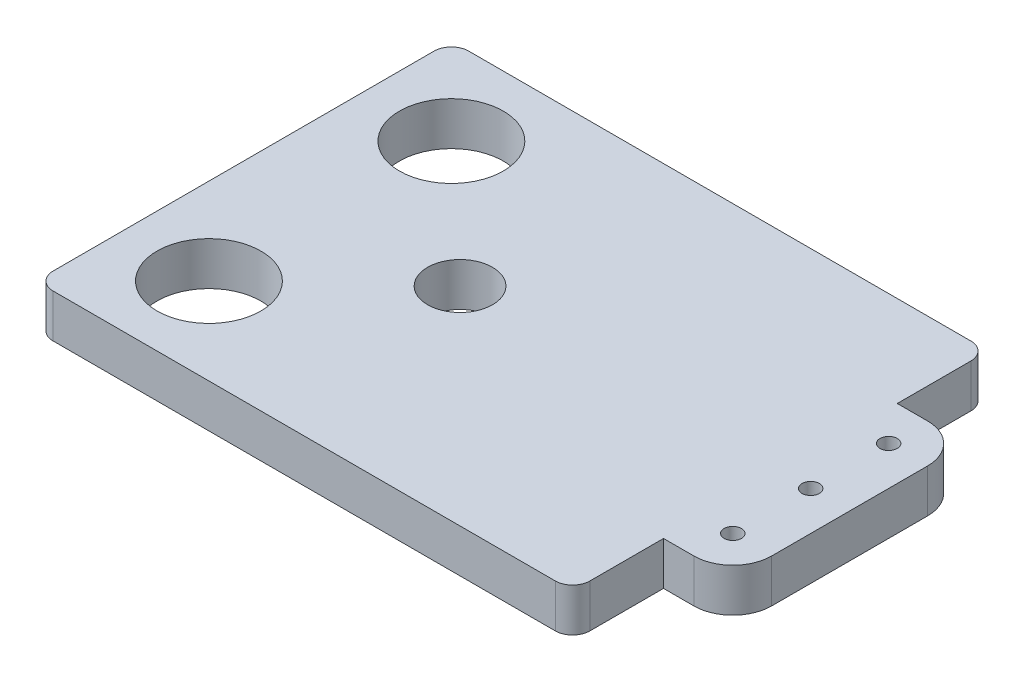
ISO-10303-21;
HEADER;
FILE_DESCRIPTION(('STEP AP214'),'2;1');
FILE_NAME('part.step','',(''),(''),'','','');
FILE_SCHEMA(('AUTOMOTIVE_DESIGN { 1 0 10303 214 1 1 1 1 }'));
ENDSEC;
DATA;
#1=APPLICATION_CONTEXT('core data for automotive mechanical design processes');
#2=APPLICATION_PROTOCOL_DEFINITION('international standard','automotive_design',2000,#1);
#3=PRODUCT_CONTEXT('',#1,'mechanical');
#4=PRODUCT('Part','Part','',(#3));
#5=PRODUCT_RELATED_PRODUCT_CATEGORY('part','',(#4));
#6=PRODUCT_DEFINITION_FORMATION('','',#4);
#7=PRODUCT_DEFINITION_CONTEXT('part definition',#1,'design');
#8=PRODUCT_DEFINITION('design','',#6,#7);
#9=PRODUCT_DEFINITION_SHAPE('','',#8);
#10=(LENGTH_UNIT() NAMED_UNIT(*) SI_UNIT(.MILLI.,.METRE.));
#11=(NAMED_UNIT(*) PLANE_ANGLE_UNIT() SI_UNIT($,.RADIAN.));
#12=(NAMED_UNIT(*) SI_UNIT($,.STERADIAN.) SOLID_ANGLE_UNIT());
#13=UNCERTAINTY_MEASURE_WITH_UNIT(LENGTH_MEASURE(1.E-05),#10,'distance_accuracy_value','');
#14=(GEOMETRIC_REPRESENTATION_CONTEXT(3) GLOBAL_UNCERTAINTY_ASSIGNED_CONTEXT((#13)) GLOBAL_UNIT_ASSIGNED_CONTEXT((#10,
#11,#12)) REPRESENTATION_CONTEXT('',''));
#15=CARTESIAN_POINT('',(0.,0.,0.));
#16=DIRECTION('',(0.,0.,1.));
#17=DIRECTION('',(1.,0.,0.));
#18=AXIS2_PLACEMENT_3D('',#15,#16,#17);
#19=CARTESIAN_POINT('',(0.,5.,-10.5));
#20=DIRECTION('',(0.,0.,1.));
#21=DIRECTION('',(1.,0.,0.));
#22=AXIS2_PLACEMENT_3D('',#19,#20,#21);
#23=PLANE('',#22);
#24=DIRECTION('',(-1.,0.,0.));
#25=VECTOR('',#24,1.);
#26=CARTESIAN_POINT('',(0.,0.,-10.5));
#27=LINE('',#26,#25);
#28=CARTESIAN_POINT('',(65.5,0.,-10.5));
#29=VERTEX_POINT('',#28);
#30=CARTESIAN_POINT('',(62.,0.,-10.5));
#31=VERTEX_POINT('',#30);
#32=EDGE_CURVE('E144',#29,#31,#27,.T.);
#33=ORIENTED_EDGE('',*,*,#32,.F.);
#34=DIRECTION('',(0.,-1.,0.));
#35=VECTOR('',#34,1.);
#36=CARTESIAN_POINT('',(65.5,5.,-10.5));
#37=LINE('',#36,#35);
#38=CARTESIAN_POINT('',(65.5,5.,-10.5));
#39=VERTEX_POINT('',#38);
#40=EDGE_CURVE('E139',#39,#29,#37,.T.);
#41=ORIENTED_EDGE('',*,*,#40,.F.);
#42=DIRECTION('',(-1.,0.,0.));
#43=VECTOR('',#42,1.);
#44=CARTESIAN_POINT('',(0.,5.,-10.5));
#45=LINE('',#44,#43);
#46=CARTESIAN_POINT('',(62.,5.,-10.5));
#47=VERTEX_POINT('',#46);
#48=EDGE_CURVE('E142',#39,#47,#45,.T.);
#49=ORIENTED_EDGE('',*,*,#48,.T.);
#50=DIRECTION('',(0.,-1.,0.));
#51=VECTOR('',#50,1.);
#52=CARTESIAN_POINT('',(62.,5.,-10.5));
#53=LINE('',#52,#51);
#54=EDGE_CURVE('E186',#47,#31,#53,.T.);
#55=ORIENTED_EDGE('',*,*,#54,.T.);
#56=EDGE_LOOP('',(#33,#41,#49,#55));
#57=FACE_BOUND('',#56,.T.);
#58=ADVANCED_FACE('F35',(#57),#23,.T.);
#59=CARTESIAN_POINT('',(65.5,5.,-15.));
#60=DIRECTION('',(0.,-1.,0.));
#61=DIRECTION('',(0.,0.,-1.));
#62=AXIS2_PLACEMENT_3D('',#59,#60,#61);
#63=CYLINDRICAL_SURFACE('',#62,4.5);
#64=CARTESIAN_POINT('',(65.5,0.,-15.));
#65=DIRECTION('',(0.,1.,0.));
#66=DIRECTION('',(0.,0.,1.));
#67=AXIS2_PLACEMENT_3D('',#64,#65,#66);
#68=CIRCLE('',#67,4.5);
#69=CARTESIAN_POINT('',(70.,0.,-15.));
#70=VERTEX_POINT('',#69);
#71=EDGE_CURVE('E206',#29,#70,#68,.T.);
#72=ORIENTED_EDGE('',*,*,#71,.T.);
#73=DIRECTION('',(0.,-1.,0.));
#74=VECTOR('',#73,1.);
#75=CARTESIAN_POINT('',(70.,5.,-15.));
#76=LINE('',#75,#74);
#77=CARTESIAN_POINT('',(70.,5.,-15.));
#78=VERTEX_POINT('',#77);
#79=EDGE_CURVE('E149',#78,#70,#76,.T.);
#80=ORIENTED_EDGE('',*,*,#79,.F.);
#81=CARTESIAN_POINT('',(65.5,5.,-15.));
#82=DIRECTION('',(0.,1.,0.));
#83=DIRECTION('',(0.,0.,1.));
#84=AXIS2_PLACEMENT_3D('',#81,#82,#83);
#85=CIRCLE('',#84,4.5);
#86=EDGE_CURVE('E152',#39,#78,#85,.T.);
#87=ORIENTED_EDGE('',*,*,#86,.F.);
#88=ORIENTED_EDGE('',*,*,#40,.T.);
#89=EDGE_LOOP('',(#72,#80,#87,#88));
#90=FACE_BOUND('',#89,.T.);
#91=ADVANCED_FACE('F153',(#90),#63,.T.);
#92=CARTESIAN_POINT('',(70.,5.,0.));
#93=DIRECTION('',(1.,0.,0.));
#94=DIRECTION('',(0.,0.,-1.));
#95=AXIS2_PLACEMENT_3D('',#92,#93,#94);
#96=PLANE('',#95);
#97=DIRECTION('',(0.,0.,1.));
#98=VECTOR('',#97,1.);
#99=CARTESIAN_POINT('',(70.,0.,0.));
#100=LINE('',#99,#98);
#101=CARTESIAN_POINT('',(70.,0.,-33.));
#102=VERTEX_POINT('',#101);
#103=EDGE_CURVE('E208',#102,#70,#100,.T.);
#104=ORIENTED_EDGE('',*,*,#103,.F.);
#105=DIRECTION('',(0.,-1.,0.));
#106=VECTOR('',#105,1.);
#107=CARTESIAN_POINT('',(70.,5.,-33.));
#108=LINE('',#107,#106);
#109=CARTESIAN_POINT('',(70.,5.,-33.));
#110=VERTEX_POINT('',#109);
#111=EDGE_CURVE('E238',#110,#102,#108,.T.);
#112=ORIENTED_EDGE('',*,*,#111,.F.);
#113=DIRECTION('',(0.,0.,1.));
#114=VECTOR('',#113,1.);
#115=CARTESIAN_POINT('',(70.,5.,0.));
#116=LINE('',#115,#114);
#117=EDGE_CURVE('E156',#110,#78,#116,.T.);
#118=ORIENTED_EDGE('',*,*,#117,.T.);
#119=ORIENTED_EDGE('',*,*,#79,.T.);
#120=EDGE_LOOP('',(#104,#112,#118,#119));
#121=FACE_BOUND('',#120,.T.);
#122=ADVANCED_FACE('F292',(#121),#96,.T.);
#123=CARTESIAN_POINT('',(65.5,5.,-33.));
#124=DIRECTION('',(0.,-1.,0.));
#125=DIRECTION('',(0.,0.,-1.));
#126=AXIS2_PLACEMENT_3D('',#123,#124,#125);
#127=CYLINDRICAL_SURFACE('',#126,4.5);
#128=CARTESIAN_POINT('',(65.5,0.,-33.));
#129=DIRECTION('',(0.,1.,0.));
#130=DIRECTION('',(0.,0.,1.));
#131=AXIS2_PLACEMENT_3D('',#128,#129,#130);
#132=CIRCLE('',#131,4.5);
#133=CARTESIAN_POINT('',(65.5,0.,-37.5));
#134=VERTEX_POINT('',#133);
#135=EDGE_CURVE('E211',#102,#134,#132,.T.);
#136=ORIENTED_EDGE('',*,*,#135,.T.);
#137=DIRECTION('',(0.,-1.,0.));
#138=VECTOR('',#137,1.);
#139=CARTESIAN_POINT('',(65.5,5.,-37.5));
#140=LINE('',#139,#138);
#141=CARTESIAN_POINT('',(65.5,5.,-37.5));
#142=VERTEX_POINT('',#141);
#143=EDGE_CURVE('E235',#142,#134,#140,.T.);
#144=ORIENTED_EDGE('',*,*,#143,.F.);
#145=CARTESIAN_POINT('',(65.5,5.,-33.));
#146=DIRECTION('',(0.,1.,0.));
#147=DIRECTION('',(0.,0.,1.));
#148=AXIS2_PLACEMENT_3D('',#145,#146,#147);
#149=CIRCLE('',#148,4.5);
#150=EDGE_CURVE('E169',#110,#142,#149,.T.);
#151=ORIENTED_EDGE('',*,*,#150,.F.);
#152=ORIENTED_EDGE('',*,*,#111,.T.);
#153=EDGE_LOOP('',(#136,#144,#151,#152));
#154=FACE_BOUND('',#153,.T.);
#155=ADVANCED_FACE('F297',(#154),#127,.T.);
#156=CARTESIAN_POINT('',(0.,5.,-37.5));
#157=DIRECTION('',(0.,0.,1.));
#158=DIRECTION('',(1.,0.,0.));
#159=AXIS2_PLACEMENT_3D('',#156,#157,#158);
#160=PLANE('',#159);
#161=DIRECTION('',(-1.,0.,0.));
#162=VECTOR('',#161,1.);
#163=CARTESIAN_POINT('',(0.,0.,-37.5));
#164=LINE('',#163,#162);
#165=CARTESIAN_POINT('',(62.,0.,-37.5));
#166=VERTEX_POINT('',#165);
#167=EDGE_CURVE('E214',#134,#166,#164,.T.);
#168=ORIENTED_EDGE('',*,*,#167,.T.);
#169=DIRECTION('',(0.,-1.,0.));
#170=VECTOR('',#169,1.);
#171=CARTESIAN_POINT('',(62.,5.,-37.5));
#172=LINE('',#171,#170);
#173=CARTESIAN_POINT('',(62.,5.,-37.5));
#174=VERTEX_POINT('',#173);
#175=EDGE_CURVE('E232',#174,#166,#172,.T.);
#176=ORIENTED_EDGE('',*,*,#175,.F.);
#177=DIRECTION('',(-1.,0.,0.));
#178=VECTOR('',#177,1.);
#179=CARTESIAN_POINT('',(0.,5.,-37.5));
#180=LINE('',#179,#178);
#181=EDGE_CURVE('E172',#142,#174,#180,.T.);
#182=ORIENTED_EDGE('',*,*,#181,.F.);
#183=ORIENTED_EDGE('',*,*,#143,.T.);
#184=EDGE_LOOP('',(#168,#176,#182,#183));
#185=FACE_BOUND('',#184,.T.);
#186=ADVANCED_FACE('F299',(#185),#160,.F.);
#187=CARTESIAN_POINT('',(62.,5.,0.));
#188=DIRECTION('',(1.,0.,0.));
#189=DIRECTION('',(0.,0.,-1.));
#190=AXIS2_PLACEMENT_3D('',#187,#188,#189);
#191=PLANE('',#190);
#192=DIRECTION('',(0.,0.,1.));
#193=VECTOR('',#192,1.);
#194=CARTESIAN_POINT('',(62.,0.,0.));
#195=LINE('',#194,#193);
#196=CARTESIAN_POINT('',(62.,0.,-46.));
#197=VERTEX_POINT('',#196);
#198=EDGE_CURVE('E217',#197,#166,#195,.T.);
#199=ORIENTED_EDGE('',*,*,#198,.F.);
#200=DIRECTION('',(0.,-1.,0.));
#201=VECTOR('',#200,1.);
#202=CARTESIAN_POINT('',(62.,5.,-46.));
#203=LINE('',#202,#201);
#204=CARTESIAN_POINT('',(62.,5.,-46.));
#205=VERTEX_POINT('',#204);
#206=EDGE_CURVE('E253',#197,#205,#203,.F.);
#207=ORIENTED_EDGE('',*,*,#206,.T.);
#208=DIRECTION('',(0.,0.,1.));
#209=VECTOR('',#208,1.);
#210=CARTESIAN_POINT('',(62.,5.,0.));
#211=LINE('',#210,#209);
#212=EDGE_CURVE('E175',#205,#174,#211,.T.);
#213=ORIENTED_EDGE('',*,*,#212,.T.);
#214=ORIENTED_EDGE('',*,*,#175,.T.);
#215=EDGE_LOOP('',(#199,#207,#213,#214));
#216=FACE_BOUND('',#215,.T.);
#217=ADVANCED_FACE('F302',(#216),#191,.T.);
#218=CARTESIAN_POINT('',(0.,5.,-48.));
#219=DIRECTION('',(0.,0.,-1.));
#220=DIRECTION('',(-1.,0.,0.));
#221=AXIS2_PLACEMENT_3D('',#218,#219,#220);
#222=PLANE('',#221);
#223=DIRECTION('',(1.,0.,0.));
#224=VECTOR('',#223,1.);
#225=CARTESIAN_POINT('',(0.,5.,-48.));
#226=LINE('',#225,#224);
#227=CARTESIAN_POINT('',(2.,5.,-48.));
#228=VERTEX_POINT('',#227);
#229=CARTESIAN_POINT('',(60.,5.,-48.));
#230=VERTEX_POINT('',#229);
#231=EDGE_CURVE('E177',#228,#230,#226,.T.);
#232=ORIENTED_EDGE('',*,*,#231,.T.);
#233=DIRECTION('',(0.,-1.,0.));
#234=VECTOR('',#233,1.);
#235=CARTESIAN_POINT('',(60.,5.,-48.));
#236=LINE('',#235,#234);
#237=CARTESIAN_POINT('',(60.,0.,-48.));
#238=VERTEX_POINT('',#237);
#239=EDGE_CURVE('E242',#230,#238,#236,.T.);
#240=ORIENTED_EDGE('',*,*,#239,.T.);
#241=DIRECTION('',(1.,0.,0.));
#242=VECTOR('',#241,1.);
#243=CARTESIAN_POINT('',(0.,0.,-48.));
#244=LINE('',#243,#242);
#245=CARTESIAN_POINT('',(2.,0.,-48.));
#246=VERTEX_POINT('',#245);
#247=EDGE_CURVE('E219',#246,#238,#244,.T.);
#248=ORIENTED_EDGE('',*,*,#247,.F.);
#249=DIRECTION('',(0.,-1.,0.));
#250=VECTOR('',#249,1.);
#251=CARTESIAN_POINT('',(2.,5.,-48.));
#252=LINE('',#251,#250);
#253=EDGE_CURVE('E148',#246,#228,#252,.F.);
#254=ORIENTED_EDGE('',*,*,#253,.T.);
#255=EDGE_LOOP('',(#232,#240,#248,#254));
#256=FACE_BOUND('',#255,.T.);
#257=ADVANCED_FACE('F310',(#256),#222,.T.);
#258=CARTESIAN_POINT('',(0.,5.,0.));
#259=DIRECTION('',(-1.,0.,0.));
#260=DIRECTION('',(0.,0.,1.));
#261=AXIS2_PLACEMENT_3D('',#258,#259,#260);
#262=PLANE('',#261);
#263=DIRECTION('',(0.,0.,-1.));
#264=VECTOR('',#263,1.);
#265=CARTESIAN_POINT('',(0.,5.,0.));
#266=LINE('',#265,#264);
#267=CARTESIAN_POINT('',(0.,5.,-2.));
#268=VERTEX_POINT('',#267);
#269=CARTESIAN_POINT('',(0.,5.,-46.));
#270=VERTEX_POINT('',#269);
#271=EDGE_CURVE('E180',#268,#270,#266,.T.);
#272=ORIENTED_EDGE('',*,*,#271,.T.);
#273=DIRECTION('',(0.,-1.,0.));
#274=VECTOR('',#273,1.);
#275=CARTESIAN_POINT('',(0.,5.,-46.));
#276=LINE('',#275,#274);
#277=CARTESIAN_POINT('',(0.,0.,-46.));
#278=VERTEX_POINT('',#277);
#279=EDGE_CURVE('E11',#270,#278,#276,.T.);
#280=ORIENTED_EDGE('',*,*,#279,.T.);
#281=DIRECTION('',(0.,0.,-1.));
#282=VECTOR('',#281,1.);
#283=CARTESIAN_POINT('',(0.,0.,0.));
#284=LINE('',#283,#282);
#285=CARTESIAN_POINT('',(0.,0.,-2.));
#286=VERTEX_POINT('',#285);
#287=EDGE_CURVE('E222',#286,#278,#284,.T.);
#288=ORIENTED_EDGE('',*,*,#287,.F.);
#289=DIRECTION('',(0.,-1.,0.));
#290=VECTOR('',#289,1.);
#291=CARTESIAN_POINT('',(0.,5.,-2.));
#292=LINE('',#291,#290);
#293=EDGE_CURVE('E43',#286,#268,#292,.F.);
#294=ORIENTED_EDGE('',*,*,#293,.T.);
#295=EDGE_LOOP('',(#272,#280,#288,#294));
#296=FACE_BOUND('',#295,.T.);
#297=ADVANCED_FACE('F272',(#296),#262,.T.);
#298=CARTESIAN_POINT('',(0.,5.,0.));
#299=DIRECTION('',(0.,0.,-1.));
#300=DIRECTION('',(-1.,0.,0.));
#301=AXIS2_PLACEMENT_3D('',#298,#299,#300);
#302=PLANE('',#301);
#303=DIRECTION('',(1.,0.,0.));
#304=VECTOR('',#303,1.);
#305=CARTESIAN_POINT('',(0.,0.,0.));
#306=LINE('',#305,#304);
#307=CARTESIAN_POINT('',(2.,0.,0.));
#308=VERTEX_POINT('',#307);
#309=CARTESIAN_POINT('',(60.,0.,0.));
#310=VERTEX_POINT('',#309);
#311=EDGE_CURVE('E225',#308,#310,#306,.T.);
#312=ORIENTED_EDGE('',*,*,#311,.T.);
#313=DIRECTION('',(0.,-1.,0.));
#314=VECTOR('',#313,1.);
#315=CARTESIAN_POINT('',(60.,5.,0.));
#316=LINE('',#315,#314);
#317=CARTESIAN_POINT('',(60.,5.,0.));
#318=VERTEX_POINT('',#317);
#319=EDGE_CURVE('E58',#310,#318,#316,.F.);
#320=ORIENTED_EDGE('',*,*,#319,.T.);
#321=DIRECTION('',(1.,0.,0.));
#322=VECTOR('',#321,1.);
#323=CARTESIAN_POINT('',(0.,5.,0.));
#324=LINE('',#323,#322);
#325=CARTESIAN_POINT('',(2.,5.,0.));
#326=VERTEX_POINT('',#325);
#327=EDGE_CURVE('E183',#326,#318,#324,.T.);
#328=ORIENTED_EDGE('',*,*,#327,.F.);
#329=DIRECTION('',(0.,-1.,0.));
#330=VECTOR('',#329,1.);
#331=CARTESIAN_POINT('',(2.,0.,0.));
#332=LINE('',#331,#330);
#333=EDGE_CURVE('E265',#326,#308,#332,.T.);
#334=ORIENTED_EDGE('',*,*,#333,.T.);
#335=EDGE_LOOP('',(#312,#320,#328,#334));
#336=FACE_BOUND('',#335,.T.);
#337=ADVANCED_FACE('F280',(#336),#302,.F.);
#338=CARTESIAN_POINT('',(65.5,5.,-33.));
#339=DIRECTION('',(0.,-1.,0.));
#340=DIRECTION('',(0.,0.,-1.));
#341=AXIS2_PLACEMENT_3D('',#338,#339,#340);
#342=CYLINDRICAL_SURFACE('',#341,0.999999999999998);
#343=CARTESIAN_POINT('',(65.5,5.,-33.));
#344=DIRECTION('',(0.,1.,0.));
#345=DIRECTION('',(0.,0.,1.));
#346=AXIS2_PLACEMENT_3D('',#343,#344,#345);
#347=CIRCLE('',#346,0.999999999999998);
#348=CARTESIAN_POINT('',(65.5,5.,-32.));
#349=VERTEX_POINT('',#348);
#350=EDGE_CURVE('E161',#349,#349,#347,.T.);
#351=ORIENTED_EDGE('',*,*,#350,.T.);
#352=EDGE_LOOP('',(#351));
#353=FACE_BOUND('',#352,.T.);
#354=CARTESIAN_POINT('',(65.5,0.,-33.));
#355=DIRECTION('',(0.,1.,0.));
#356=DIRECTION('',(0.,0.,1.));
#357=AXIS2_PLACEMENT_3D('',#354,#355,#356);
#358=CIRCLE('',#357,0.999999999999998);
#359=CARTESIAN_POINT('',(65.5,0.,-32.));
#360=VERTEX_POINT('',#359);
#361=EDGE_CURVE('E202',#360,#360,#358,.T.);
#362=ORIENTED_EDGE('',*,*,#361,.F.);
#363=EDGE_LOOP('',(#362));
#364=FACE_BOUND('',#363,.T.);
#365=ADVANCED_FACE('F328',(#353,#364),#342,.F.);
#366=CARTESIAN_POINT('',(65.5,5.,-24.));
#367=DIRECTION('',(0.,-1.,0.));
#368=DIRECTION('',(0.,0.,-1.));
#369=AXIS2_PLACEMENT_3D('',#366,#367,#368);
#370=CYLINDRICAL_SURFACE('',#369,0.999999999999998);
#371=CARTESIAN_POINT('',(65.5,5.,-24.));
#372=DIRECTION('',(0.,1.,0.));
#373=DIRECTION('',(0.,0.,1.));
#374=AXIS2_PLACEMENT_3D('',#371,#372,#373);
#375=CIRCLE('',#374,0.999999999999998);
#376=CARTESIAN_POINT('',(65.5,5.,-23.));
#377=VERTEX_POINT('',#376);
#378=EDGE_CURVE('E164',#377,#377,#375,.T.);
#379=ORIENTED_EDGE('',*,*,#378,.T.);
#380=EDGE_LOOP('',(#379));
#381=FACE_BOUND('',#380,.T.);
#382=CARTESIAN_POINT('',(65.5,0.,-24.));
#383=DIRECTION('',(0.,1.,0.));
#384=DIRECTION('',(0.,0.,1.));
#385=AXIS2_PLACEMENT_3D('',#382,#383,#384);
#386=CIRCLE('',#385,0.999999999999998);
#387=CARTESIAN_POINT('',(65.5,0.,-23.));
#388=VERTEX_POINT('',#387);
#389=EDGE_CURVE('E199',#388,#388,#386,.T.);
#390=ORIENTED_EDGE('',*,*,#389,.F.);
#391=EDGE_LOOP('',(#390));
#392=FACE_BOUND('',#391,.T.);
#393=ADVANCED_FACE('F331',(#381,#392),#370,.F.);
#394=CARTESIAN_POINT('',(65.5,5.,-15.));
#395=DIRECTION('',(0.,-1.,0.));
#396=DIRECTION('',(0.,0.,-1.));
#397=AXIS2_PLACEMENT_3D('',#394,#395,#396);
#398=CYLINDRICAL_SURFACE('',#397,0.999999999999998);
#399=CARTESIAN_POINT('',(65.5,5.,-15.));
#400=DIRECTION('',(0.,1.,0.));
#401=DIRECTION('',(0.,0.,1.));
#402=AXIS2_PLACEMENT_3D('',#399,#400,#401);
#403=CIRCLE('',#402,0.999999999999998);
#404=CARTESIAN_POINT('',(65.5,5.,-14.));
#405=VERTEX_POINT('',#404);
#406=EDGE_CURVE('E533',#405,#405,#403,.T.);
#407=ORIENTED_EDGE('',*,*,#406,.T.);
#408=EDGE_LOOP('',(#407));
#409=FACE_BOUND('',#408,.T.);
#410=CARTESIAN_POINT('',(65.5,0.,-15.));
#411=DIRECTION('',(0.,1.,0.));
#412=DIRECTION('',(0.,0.,1.));
#413=AXIS2_PLACEMENT_3D('',#410,#411,#412);
#414=CIRCLE('',#413,0.999999999999998);
#415=CARTESIAN_POINT('',(65.5,0.,-14.));
#416=VERTEX_POINT('',#415);
#417=EDGE_CURVE('E196',#416,#416,#414,.T.);
#418=ORIENTED_EDGE('',*,*,#417,.F.);
#419=EDGE_LOOP('',(#418));
#420=FACE_BOUND('',#419,.T.);
#421=ADVANCED_FACE('F335',(#409,#420),#398,.F.);
#422=CARTESIAN_POINT('',(25.,5.,-24.));
#423=DIRECTION('',(0.,-1.,0.));
#424=DIRECTION('',(0.,0.,-1.));
#425=AXIS2_PLACEMENT_3D('',#422,#423,#424);
#426=CYLINDRICAL_SURFACE('',#425,3.75);
#427=CARTESIAN_POINT('',(25.,5.,-24.));
#428=DIRECTION('',(0.,1.,0.));
#429=DIRECTION('',(0.,0.,1.));
#430=AXIS2_PLACEMENT_3D('',#427,#428,#429);
#431=CIRCLE('',#430,3.75);
#432=CARTESIAN_POINT('',(25.,5.,-20.25));
#433=VERTEX_POINT('',#432);
#434=EDGE_CURVE('E529',#433,#433,#431,.T.);
#435=ORIENTED_EDGE('',*,*,#434,.T.);
#436=EDGE_LOOP('',(#435));
#437=FACE_BOUND('',#436,.T.);
#438=CARTESIAN_POINT('',(25.,0.,-24.));
#439=DIRECTION('',(0.,1.,0.));
#440=DIRECTION('',(0.,0.,1.));
#441=AXIS2_PLACEMENT_3D('',#438,#439,#440);
#442=CIRCLE('',#441,3.75);
#443=CARTESIAN_POINT('',(25.,0.,-20.25));
#444=VERTEX_POINT('',#443);
#445=EDGE_CURVE('E193',#444,#444,#442,.T.);
#446=ORIENTED_EDGE('',*,*,#445,.F.);
#447=EDGE_LOOP('',(#446));
#448=FACE_BOUND('',#447,.T.);
#449=ADVANCED_FACE('F339',(#437,#448),#426,.F.);
#450=CARTESIAN_POINT('',(10.,5.,-38.));
#451=DIRECTION('',(0.,-1.,0.));
#452=DIRECTION('',(0.,0.,-1.));
#453=AXIS2_PLACEMENT_3D('',#450,#451,#452);
#454=CYLINDRICAL_SURFACE('',#453,6.);
#455=CARTESIAN_POINT('',(10.,5.,-38.));
#456=DIRECTION('',(0.,1.,0.));
#457=DIRECTION('',(0.,0.,1.));
#458=AXIS2_PLACEMENT_3D('',#455,#456,#457);
#459=CIRCLE('',#458,6.);
#460=CARTESIAN_POINT('',(10.,5.,-32.));
#461=VERTEX_POINT('',#460);
#462=EDGE_CURVE('E525',#461,#461,#459,.T.);
#463=ORIENTED_EDGE('',*,*,#462,.T.);
#464=EDGE_LOOP('',(#463));
#465=FACE_BOUND('',#464,.T.);
#466=CARTESIAN_POINT('',(10.,0.,-38.));
#467=DIRECTION('',(0.,1.,0.));
#468=DIRECTION('',(0.,0.,1.));
#469=AXIS2_PLACEMENT_3D('',#466,#467,#468);
#470=CIRCLE('',#469,6.);
#471=CARTESIAN_POINT('',(10.,0.,-32.));
#472=VERTEX_POINT('',#471);
#473=EDGE_CURVE('E190',#472,#472,#470,.T.);
#474=ORIENTED_EDGE('',*,*,#473,.F.);
#475=EDGE_LOOP('',(#474));
#476=FACE_BOUND('',#475,.T.);
#477=ADVANCED_FACE('F343',(#465,#476),#454,.F.);
#478=CARTESIAN_POINT('',(10.,5.,-10.));
#479=DIRECTION('',(0.,-1.,0.));
#480=DIRECTION('',(0.,0.,-1.));
#481=AXIS2_PLACEMENT_3D('',#478,#479,#480);
#482=CYLINDRICAL_SURFACE('',#481,6.);
#483=CARTESIAN_POINT('',(10.,5.,-10.));
#484=DIRECTION('',(0.,1.,0.));
#485=DIRECTION('',(0.,0.,1.));
#486=AXIS2_PLACEMENT_3D('',#483,#484,#485);
#487=CIRCLE('',#486,6.);
#488=CARTESIAN_POINT('',(10.,5.,-4.));
#489=VERTEX_POINT('',#488);
#490=EDGE_CURVE('E230',#489,#489,#487,.T.);
#491=ORIENTED_EDGE('',*,*,#490,.T.);
#492=EDGE_LOOP('',(#491));
#493=FACE_BOUND('',#492,.T.);
#494=CARTESIAN_POINT('',(10.,0.,-10.));
#495=DIRECTION('',(0.,1.,0.));
#496=DIRECTION('',(0.,0.,1.));
#497=AXIS2_PLACEMENT_3D('',#494,#495,#496);
#498=CIRCLE('',#497,6.);
#499=CARTESIAN_POINT('',(10.,0.,-4.));
#500=VERTEX_POINT('',#499);
#501=EDGE_CURVE('E187',#500,#500,#498,.T.);
#502=ORIENTED_EDGE('',*,*,#501,.F.);
#503=EDGE_LOOP('',(#502));
#504=FACE_BOUND('',#503,.T.);
#505=ADVANCED_FACE('F347',(#493,#504),#482,.F.);
#506=CARTESIAN_POINT('',(62.,5.,0.));
#507=DIRECTION('',(1.,0.,0.));
#508=DIRECTION('',(0.,0.,-1.));
#509=AXIS2_PLACEMENT_3D('',#506,#507,#508);
#510=PLANE('',#509);
#511=DIRECTION('',(0.,0.,1.));
#512=VECTOR('',#511,1.);
#513=CARTESIAN_POINT('',(62.,5.,0.));
#514=LINE('',#513,#512);
#515=CARTESIAN_POINT('',(62.,5.,-2.));
#516=VERTEX_POINT('',#515);
#517=EDGE_CURVE('E160',#47,#516,#514,.T.);
#518=ORIENTED_EDGE('',*,*,#517,.T.);
#519=DIRECTION('',(0.,-1.,0.));
#520=VECTOR('',#519,1.);
#521=CARTESIAN_POINT('',(62.,0.,-2.));
#522=LINE('',#521,#520);
#523=CARTESIAN_POINT('',(62.,0.,-2.));
#524=VERTEX_POINT('',#523);
#525=EDGE_CURVE('E262',#516,#524,#522,.T.);
#526=ORIENTED_EDGE('',*,*,#525,.T.);
#527=DIRECTION('',(0.,0.,1.));
#528=VECTOR('',#527,1.);
#529=CARTESIAN_POINT('',(62.,0.,0.));
#530=LINE('',#529,#528);
#531=EDGE_CURVE('E227',#31,#524,#530,.T.);
#532=ORIENTED_EDGE('',*,*,#531,.F.);
#533=ORIENTED_EDGE('',*,*,#54,.F.);
#534=EDGE_LOOP('',(#518,#526,#532,#533));
#535=FACE_BOUND('',#534,.T.);
#536=ADVANCED_FACE('F288',(#535),#510,.T.);
#537=CARTESIAN_POINT('',(0.,5.,0.));
#538=DIRECTION('',(0.,1.,0.));
#539=DIRECTION('',(0.,0.,1.));
#540=AXIS2_PLACEMENT_3D('',#537,#538,#539);
#541=PLANE('',#540);
#542=ORIENTED_EDGE('',*,*,#490,.F.);
#543=EDGE_LOOP('',(#542));
#544=FACE_BOUND('',#543,.T.);
#545=ORIENTED_EDGE('',*,*,#462,.F.);
#546=EDGE_LOOP('',(#545));
#547=FACE_BOUND('',#546,.T.);
#548=ORIENTED_EDGE('',*,*,#434,.F.);
#549=EDGE_LOOP('',(#548));
#550=FACE_BOUND('',#549,.T.);
#551=ORIENTED_EDGE('',*,*,#406,.F.);
#552=EDGE_LOOP('',(#551));
#553=FACE_BOUND('',#552,.T.);
#554=ORIENTED_EDGE('',*,*,#378,.F.);
#555=EDGE_LOOP('',(#554));
#556=FACE_BOUND('',#555,.T.);
#557=ORIENTED_EDGE('',*,*,#350,.F.);
#558=EDGE_LOOP('',(#557));
#559=FACE_BOUND('',#558,.T.);
#560=ORIENTED_EDGE('',*,*,#212,.F.);
#561=CARTESIAN_POINT('',(60.,5.,-46.));
#562=DIRECTION('',(0.,1.,0.));
#563=DIRECTION('',(0.,0.,1.));
#564=AXIS2_PLACEMENT_3D('',#561,#562,#563);
#565=CIRCLE('',#564,2.);
#566=EDGE_CURVE('E260',#205,#230,#565,.T.);
#567=ORIENTED_EDGE('',*,*,#566,.T.);
#568=ORIENTED_EDGE('',*,*,#231,.F.);
#569=CARTESIAN_POINT('',(2.,5.,-46.));
#570=DIRECTION('',(0.,1.,0.));
#571=DIRECTION('',(0.,0.,1.));
#572=AXIS2_PLACEMENT_3D('',#569,#570,#571);
#573=CIRCLE('',#572,2.);
#574=EDGE_CURVE('E257',#228,#270,#573,.T.);
#575=ORIENTED_EDGE('',*,*,#574,.T.);
#576=ORIENTED_EDGE('',*,*,#271,.F.);
#577=CARTESIAN_POINT('',(2.,5.,-2.));
#578=DIRECTION('',(0.,1.,0.));
#579=DIRECTION('',(0.,0.,1.));
#580=AXIS2_PLACEMENT_3D('',#577,#578,#579);
#581=CIRCLE('',#580,2.);
#582=EDGE_CURVE('E255',#268,#326,#581,.T.);
#583=ORIENTED_EDGE('',*,*,#582,.T.);
#584=ORIENTED_EDGE('',*,*,#327,.T.);
#585=CARTESIAN_POINT('',(60.,5.,-2.));
#586=DIRECTION('',(0.,1.,0.));
#587=DIRECTION('',(0.,0.,1.));
#588=AXIS2_PLACEMENT_3D('',#585,#586,#587);
#589=CIRCLE('',#588,2.);
#590=EDGE_CURVE('E50',#318,#516,#589,.T.);
#591=ORIENTED_EDGE('',*,*,#590,.T.);
#592=ORIENTED_EDGE('',*,*,#517,.F.);
#593=ORIENTED_EDGE('',*,*,#48,.F.);
#594=ORIENTED_EDGE('',*,*,#86,.T.);
#595=ORIENTED_EDGE('',*,*,#117,.F.);
#596=ORIENTED_EDGE('',*,*,#150,.T.);
#597=ORIENTED_EDGE('',*,*,#181,.T.);
#598=EDGE_LOOP('',(#560,#567,#568,#575,#576,#583,#584,#591,#592,#593,#594,#595,#596,#597));
#599=FACE_BOUND('',#598,.T.);
#600=ADVANCED_FACE('F159',(#544,#547,#550,#553,#556,#559,#599),#541,.T.);
#601=CARTESIAN_POINT('',(0.,0.,0.));
#602=DIRECTION('',(0.,1.,0.));
#603=DIRECTION('',(0.,0.,1.));
#604=AXIS2_PLACEMENT_3D('',#601,#602,#603);
#605=PLANE('',#604);
#606=ORIENTED_EDGE('',*,*,#501,.T.);
#607=EDGE_LOOP('',(#606));
#608=FACE_BOUND('',#607,.T.);
#609=ORIENTED_EDGE('',*,*,#473,.T.);
#610=EDGE_LOOP('',(#609));
#611=FACE_BOUND('',#610,.T.);
#612=ORIENTED_EDGE('',*,*,#445,.T.);
#613=EDGE_LOOP('',(#612));
#614=FACE_BOUND('',#613,.T.);
#615=ORIENTED_EDGE('',*,*,#417,.T.);
#616=EDGE_LOOP('',(#615));
#617=FACE_BOUND('',#616,.T.);
#618=ORIENTED_EDGE('',*,*,#389,.T.);
#619=EDGE_LOOP('',(#618));
#620=FACE_BOUND('',#619,.T.);
#621=ORIENTED_EDGE('',*,*,#361,.T.);
#622=EDGE_LOOP('',(#621));
#623=FACE_BOUND('',#622,.T.);
#624=ORIENTED_EDGE('',*,*,#247,.T.);
#625=CARTESIAN_POINT('',(60.,0.,-46.));
#626=DIRECTION('',(0.,1.,0.));
#627=DIRECTION('',(0.,0.,1.));
#628=AXIS2_PLACEMENT_3D('',#625,#626,#627);
#629=CIRCLE('',#628,2.);
#630=EDGE_CURVE('E251',#238,#197,#629,.F.);
#631=ORIENTED_EDGE('',*,*,#630,.T.);
#632=ORIENTED_EDGE('',*,*,#198,.T.);
#633=ORIENTED_EDGE('',*,*,#167,.F.);
#634=ORIENTED_EDGE('',*,*,#135,.F.);
#635=ORIENTED_EDGE('',*,*,#103,.T.);
#636=ORIENTED_EDGE('',*,*,#71,.F.);
#637=ORIENTED_EDGE('',*,*,#32,.T.);
#638=ORIENTED_EDGE('',*,*,#531,.T.);
#639=CARTESIAN_POINT('',(60.,0.,-2.));
#640=DIRECTION('',(0.,1.,0.));
#641=DIRECTION('',(0.,0.,1.));
#642=AXIS2_PLACEMENT_3D('',#639,#640,#641);
#643=CIRCLE('',#642,2.);
#644=EDGE_CURVE('E249',#524,#310,#643,.F.);
#645=ORIENTED_EDGE('',*,*,#644,.T.);
#646=ORIENTED_EDGE('',*,*,#311,.F.);
#647=CARTESIAN_POINT('',(2.,0.,-2.));
#648=DIRECTION('',(0.,1.,0.));
#649=DIRECTION('',(0.,0.,1.));
#650=AXIS2_PLACEMENT_3D('',#647,#648,#649);
#651=CIRCLE('',#650,2.);
#652=EDGE_CURVE('E245',#308,#286,#651,.F.);
#653=ORIENTED_EDGE('',*,*,#652,.T.);
#654=ORIENTED_EDGE('',*,*,#287,.T.);
#655=CARTESIAN_POINT('',(2.,0.,-46.));
#656=DIRECTION('',(0.,1.,0.));
#657=DIRECTION('',(0.,0.,1.));
#658=AXIS2_PLACEMENT_3D('',#655,#656,#657);
#659=CIRCLE('',#658,2.);
#660=EDGE_CURVE('E247',#278,#246,#659,.F.);
#661=ORIENTED_EDGE('',*,*,#660,.T.);
#662=EDGE_LOOP('',(#624,#631,#632,#633,#634,#635,#636,#637,#638,#645,#646,#653,#654,#661));
#663=FACE_BOUND('',#662,.T.);
#664=ADVANCED_FACE('F282',(#608,#611,#614,#617,#620,#623,#663),#605,.F.);
#665=CARTESIAN_POINT('',(60.,5.,-46.));
#666=DIRECTION('',(0.,-1.,0.));
#667=DIRECTION('',(0.,0.,-1.));
#668=AXIS2_PLACEMENT_3D('',#665,#666,#667);
#669=CYLINDRICAL_SURFACE('',#668,2.);
#670=ORIENTED_EDGE('',*,*,#566,.F.);
#671=ORIENTED_EDGE('',*,*,#206,.F.);
#672=ORIENTED_EDGE('',*,*,#630,.F.);
#673=ORIENTED_EDGE('',*,*,#239,.F.);
#674=EDGE_LOOP('',(#670,#671,#672,#673));
#675=FACE_BOUND('',#674,.T.);
#676=ADVANCED_FACE('F307',(#675),#669,.T.);
#677=CARTESIAN_POINT('',(60.,5.,-2.));
#678=DIRECTION('',(0.,1.,0.));
#679=DIRECTION('',(0.,0.,1.));
#680=AXIS2_PLACEMENT_3D('',#677,#678,#679);
#681=CYLINDRICAL_SURFACE('',#680,2.);
#682=ORIENTED_EDGE('',*,*,#590,.F.);
#683=ORIENTED_EDGE('',*,*,#319,.F.);
#684=ORIENTED_EDGE('',*,*,#644,.F.);
#685=ORIENTED_EDGE('',*,*,#525,.F.);
#686=EDGE_LOOP('',(#682,#683,#684,#685));
#687=FACE_BOUND('',#686,.T.);
#688=ADVANCED_FACE('F286',(#687),#681,.T.);
#689=CARTESIAN_POINT('',(2.,5.,-46.));
#690=DIRECTION('',(0.,-1.,0.));
#691=DIRECTION('',(0.,0.,-1.));
#692=AXIS2_PLACEMENT_3D('',#689,#690,#691);
#693=CYLINDRICAL_SURFACE('',#692,2.);
#694=ORIENTED_EDGE('',*,*,#574,.F.);
#695=ORIENTED_EDGE('',*,*,#253,.F.);
#696=ORIENTED_EDGE('',*,*,#660,.F.);
#697=ORIENTED_EDGE('',*,*,#279,.F.);
#698=EDGE_LOOP('',(#694,#695,#696,#697));
#699=FACE_BOUND('',#698,.T.);
#700=ADVANCED_FACE('F313',(#699),#693,.T.);
#701=CARTESIAN_POINT('',(2.,5.,-2.));
#702=DIRECTION('',(0.,1.,0.));
#703=DIRECTION('',(0.,0.,1.));
#704=AXIS2_PLACEMENT_3D('',#701,#702,#703);
#705=CYLINDRICAL_SURFACE('',#704,2.);
#706=ORIENTED_EDGE('',*,*,#582,.F.);
#707=ORIENTED_EDGE('',*,*,#293,.F.);
#708=ORIENTED_EDGE('',*,*,#652,.F.);
#709=ORIENTED_EDGE('',*,*,#333,.F.);
#710=EDGE_LOOP('',(#706,#707,#708,#709));
#711=FACE_BOUND('',#710,.T.);
#712=ADVANCED_FACE('F37',(#711),#705,.T.);
#713=CLOSED_SHELL('',(#58,#91,#122,#155,#186,#217,#257,#297,#337,#365,#393,#421,#449,#477,#505,
#536,#600,#664,#676,#688,#700,#712));
#714=MANIFOLD_SOLID_BREP('B2',#713);
#715=ADVANCED_BREP_SHAPE_REPRESENTATION('',(#18,#714),#14);
#716=SHAPE_DEFINITION_REPRESENTATION(#9,#715);
ENDSEC;
END-ISO-10303-21;
